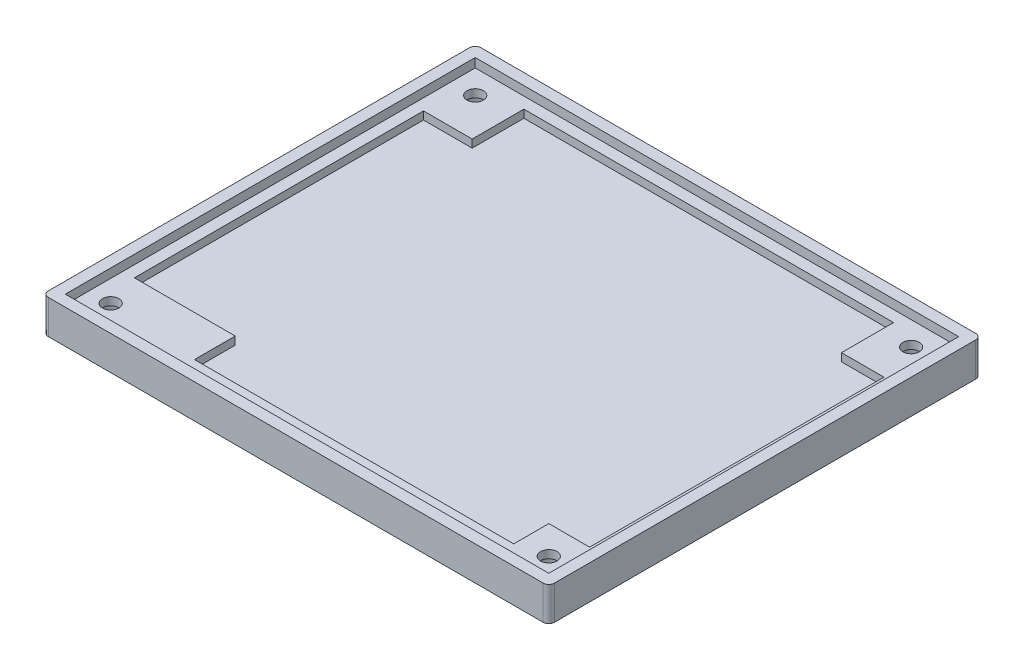
ISO-10303-21;
HEADER;
FILE_DESCRIPTION(('STEP AP214'),'2;1');
FILE_NAME('part.step','',(''),(''),'','','');
FILE_SCHEMA(('AUTOMOTIVE_DESIGN { 1 0 10303 214 1 1 1 1 }'));
ENDSEC;
DATA;
#1=APPLICATION_CONTEXT('core data for automotive mechanical design processes');
#2=APPLICATION_PROTOCOL_DEFINITION('international standard','automotive_design',2000,#1);
#3=PRODUCT_CONTEXT('',#1,'mechanical');
#4=PRODUCT('Part','Part','',(#3));
#5=PRODUCT_RELATED_PRODUCT_CATEGORY('part','',(#4));
#6=PRODUCT_DEFINITION_FORMATION('','',#4);
#7=PRODUCT_DEFINITION_CONTEXT('part definition',#1,'design');
#8=PRODUCT_DEFINITION('design','',#6,#7);
#9=PRODUCT_DEFINITION_SHAPE('','',#8);
#10=(LENGTH_UNIT() NAMED_UNIT(*) SI_UNIT(.MILLI.,.METRE.));
#11=(NAMED_UNIT(*) PLANE_ANGLE_UNIT() SI_UNIT($,.RADIAN.));
#12=(NAMED_UNIT(*) SI_UNIT($,.STERADIAN.) SOLID_ANGLE_UNIT());
#13=UNCERTAINTY_MEASURE_WITH_UNIT(LENGTH_MEASURE(1.E-05),#10,'distance_accuracy_value','');
#14=(GEOMETRIC_REPRESENTATION_CONTEXT(3) GLOBAL_UNCERTAINTY_ASSIGNED_CONTEXT((#13)) GLOBAL_UNIT_ASSIGNED_CONTEXT((#10,
#11,#12)) REPRESENTATION_CONTEXT('',''));
#15=CARTESIAN_POINT('',(0.,0.,0.));
#16=DIRECTION('',(0.,0.,1.));
#17=DIRECTION('',(1.,0.,0.));
#18=AXIS2_PLACEMENT_3D('',#15,#16,#17);
#19=CARTESIAN_POINT('',(13.6094686628136,-6.,-36.5043022127827));
#20=DIRECTION('',(0.,1.,0.));
#21=DIRECTION('',(0.,0.,1.));
#22=AXIS2_PLACEMENT_3D('',#19,#20,#21);
#23=CYLINDRICAL_SURFACE('',#22,1.45);
#24=CARTESIAN_POINT('',(13.6094686628136,-1.6,-36.5043022127827));
#25=DIRECTION('',(0.,1.,0.));
#26=DIRECTION('',(0.,0.,1.));
#27=AXIS2_PLACEMENT_3D('',#24,#25,#26);
#28=CIRCLE('',#27,1.45);
#29=CARTESIAN_POINT('',(13.6094686628136,-1.6,-35.0543022127827));
#30=VERTEX_POINT('',#29);
#31=EDGE_CURVE('E216',#30,#30,#28,.T.);
#32=ORIENTED_EDGE('',*,*,#31,.T.);
#33=EDGE_LOOP('',(#32));
#34=FACE_BOUND('',#33,.T.);
#35=CARTESIAN_POINT('',(13.6094686628136,-3.,-36.5043022127827));
#36=DIRECTION('',(0.,-1.,0.));
#37=DIRECTION('',(0.,0.,-1.));
#38=AXIS2_PLACEMENT_3D('',#35,#36,#37);
#39=CIRCLE('',#38,1.45);
#40=CARTESIAN_POINT('',(13.6094686628136,-3.,-37.9543022127827));
#41=VERTEX_POINT('',#40);
#42=EDGE_CURVE('E37',#41,#41,#39,.F.);
#43=ORIENTED_EDGE('',*,*,#42,.F.);
#44=EDGE_LOOP('',(#43));
#45=FACE_BOUND('',#44,.T.);
#46=ADVANCED_FACE('F33',(#34,#45),#23,.F.);
#47=CARTESIAN_POINT('',(-63.7758367272501,-6.,27.4956977872173));
#48=DIRECTION('',(0.,1.,0.));
#49=DIRECTION('',(0.,0.,1.));
#50=AXIS2_PLACEMENT_3D('',#47,#48,#49);
#51=CYLINDRICAL_SURFACE('',#50,1.45);
#52=CARTESIAN_POINT('',(-63.7758367272501,-1.6,27.4956977872173));
#53=DIRECTION('',(0.,1.,0.));
#54=DIRECTION('',(0.,0.,1.));
#55=AXIS2_PLACEMENT_3D('',#52,#53,#54);
#56=CIRCLE('',#55,1.45);
#57=CARTESIAN_POINT('',(-63.7758367272501,-1.6,28.9456977872173));
#58=VERTEX_POINT('',#57);
#59=EDGE_CURVE('E354',#58,#58,#56,.T.);
#60=ORIENTED_EDGE('',*,*,#59,.T.);
#61=EDGE_LOOP('',(#60));
#62=FACE_BOUND('',#61,.T.);
#63=CARTESIAN_POINT('',(-63.7758367272501,-3.,27.4956977872173));
#64=DIRECTION('',(0.,-1.,0.));
#65=DIRECTION('',(0.,0.,-1.));
#66=AXIS2_PLACEMENT_3D('',#63,#64,#65);
#67=CIRCLE('',#66,1.45);
#68=CARTESIAN_POINT('',(-63.7758367272501,-3.,26.0456977872173));
#69=VERTEX_POINT('',#68);
#70=EDGE_CURVE('E349',#69,#69,#67,.F.);
#71=ORIENTED_EDGE('',*,*,#70,.F.);
#72=EDGE_LOOP('',(#71));
#73=FACE_BOUND('',#72,.T.);
#74=ADVANCED_FACE('F464',(#62,#73),#51,.F.);
#75=CARTESIAN_POINT('',(-63.3905313371864,-6.,-36.5043022127827));
#76=DIRECTION('',(0.,1.,0.));
#77=DIRECTION('',(0.,0.,1.));
#78=AXIS2_PLACEMENT_3D('',#75,#76,#77);
#79=CYLINDRICAL_SURFACE('',#78,1.45);
#80=CARTESIAN_POINT('',(-63.3905313371864,-1.6,-36.5043022127827));
#81=DIRECTION('',(0.,1.,0.));
#82=DIRECTION('',(0.,0.,1.));
#83=AXIS2_PLACEMENT_3D('',#80,#81,#82);
#84=CIRCLE('',#83,1.45);
#85=CARTESIAN_POINT('',(-63.3905313371864,-1.6,-35.0543022127827));
#86=VERTEX_POINT('',#85);
#87=EDGE_CURVE('E358',#86,#86,#84,.T.);
#88=ORIENTED_EDGE('',*,*,#87,.T.);
#89=EDGE_LOOP('',(#88));
#90=FACE_BOUND('',#89,.T.);
#91=CARTESIAN_POINT('',(-63.3905313371864,-3.,-36.5043022127827));
#92=DIRECTION('',(0.,-1.,0.));
#93=DIRECTION('',(0.,0.,-1.));
#94=AXIS2_PLACEMENT_3D('',#91,#92,#93);
#95=CIRCLE('',#94,1.45);
#96=CARTESIAN_POINT('',(-63.3905313371864,-3.,-37.9543022127827));
#97=VERTEX_POINT('',#96);
#98=EDGE_CURVE('E346',#97,#97,#95,.F.);
#99=ORIENTED_EDGE('',*,*,#98,.F.);
#100=EDGE_LOOP('',(#99));
#101=FACE_BOUND('',#100,.T.);
#102=ADVANCED_FACE('F470',(#90,#101),#79,.F.);
#103=CARTESIAN_POINT('',(13.6094686628136,-6.,27.4956977872173));
#104=DIRECTION('',(0.,1.,0.));
#105=DIRECTION('',(0.,0.,1.));
#106=AXIS2_PLACEMENT_3D('',#103,#104,#105);
#107=CYLINDRICAL_SURFACE('',#106,1.45);
#108=CARTESIAN_POINT('',(13.6094686628136,-1.6,27.4956977872173));
#109=DIRECTION('',(0.,1.,0.));
#110=DIRECTION('',(0.,0.,1.));
#111=AXIS2_PLACEMENT_3D('',#108,#109,#110);
#112=CIRCLE('',#111,1.45);
#113=CARTESIAN_POINT('',(13.6094686628136,-1.6,28.9456977872173));
#114=VERTEX_POINT('',#113);
#115=EDGE_CURVE('E363',#114,#114,#112,.T.);
#116=ORIENTED_EDGE('',*,*,#115,.T.);
#117=EDGE_LOOP('',(#116));
#118=FACE_BOUND('',#117,.T.);
#119=CARTESIAN_POINT('',(13.6094686628136,-3.,27.4956977872173));
#120=DIRECTION('',(0.,-1.,0.));
#121=DIRECTION('',(0.,0.,-1.));
#122=AXIS2_PLACEMENT_3D('',#119,#120,#121);
#123=CIRCLE('',#122,1.45);
#124=CARTESIAN_POINT('',(13.6094686628136,-3.,26.0456977872173));
#125=VERTEX_POINT('',#124);
#126=EDGE_CURVE('E343',#125,#125,#123,.F.);
#127=ORIENTED_EDGE('',*,*,#126,.F.);
#128=EDGE_LOOP('',(#127));
#129=FACE_BOUND('',#128,.T.);
#130=ADVANCED_FACE('F651',(#118,#129),#107,.F.);
#131=CARTESIAN_POINT('',(0.,-1.6,0.));
#132=DIRECTION('',(0.,1.,0.));
#133=DIRECTION('',(0.,0.,1.));
#134=AXIS2_PLACEMENT_3D('',#131,#132,#133);
#135=PLANE('',#134);
#136=ORIENTED_EDGE('',*,*,#115,.F.);
#137=EDGE_LOOP('',(#136));
#138=FACE_BOUND('',#137,.T.);
#139=ORIENTED_EDGE('',*,*,#87,.F.);
#140=EDGE_LOOP('',(#139));
#141=FACE_BOUND('',#140,.T.);
#142=ORIENTED_EDGE('',*,*,#59,.F.);
#143=EDGE_LOOP('',(#142));
#144=FACE_BOUND('',#143,.T.);
#145=ORIENTED_EDGE('',*,*,#31,.F.);
#146=EDGE_LOOP('',(#145));
#147=FACE_BOUND('',#146,.T.);
#148=DIRECTION('',(0.,0.,1.));
#149=VECTOR('',#148,1.);
#150=CARTESIAN_POINT('',(-67.5905313371864,-1.6,-40.7043022127827));
#151=LINE('',#150,#149);
#152=CARTESIAN_POINT('',(-67.5905313371864,-1.6,-40.7043022127827));
#153=VERTEX_POINT('',#152);
#154=CARTESIAN_POINT('',(-67.5905313371864,-1.6,31.6956977872173));
#155=VERTEX_POINT('',#154);
#156=EDGE_CURVE('E230',#153,#155,#151,.T.);
#157=ORIENTED_EDGE('',*,*,#156,.T.);
#158=DIRECTION('',(1.,0.,0.));
#159=VECTOR('',#158,1.);
#160=CARTESIAN_POINT('',(-67.5905313371864,-1.6,31.6956977872173));
#161=LINE('',#160,#159);
#162=CARTESIAN_POINT('',(17.8094686628136,-1.6,31.6956977872173));
#163=VERTEX_POINT('',#162);
#164=EDGE_CURVE('E233',#155,#163,#161,.T.);
#165=ORIENTED_EDGE('',*,*,#164,.T.);
#166=DIRECTION('',(0.,0.,1.));
#167=VECTOR('',#166,1.);
#168=CARTESIAN_POINT('',(17.8094686628136,-1.6,-40.7043022127827));
#169=LINE('',#168,#167);
#170=CARTESIAN_POINT('',(17.8094686628136,-1.6,-40.7043022127827));
#171=VERTEX_POINT('',#170);
#172=EDGE_CURVE('E237',#171,#163,#169,.T.);
#173=ORIENTED_EDGE('',*,*,#172,.F.);
#174=DIRECTION('',(1.,0.,0.));
#175=VECTOR('',#174,1.);
#176=CARTESIAN_POINT('',(-67.5905313371864,-1.6,-40.7043022127827));
#177=LINE('',#176,#175);
#178=EDGE_CURVE('E239',#153,#171,#177,.T.);
#179=ORIENTED_EDGE('',*,*,#178,.F.);
#180=EDGE_LOOP('',(#157,#165,#173,#179));
#181=FACE_BOUND('',#180,.T.);
#182=DIRECTION('',(-1.,0.,0.));
#183=VECTOR('',#182,1.);
#184=CARTESIAN_POINT('',(0.,-1.6,21.4956977872173));
#185=LINE('',#184,#183);
#186=CARTESIAN_POINT('',(-47.7758367272501,-1.6,21.4956977872174));
#187=VERTEX_POINT('',#186);
#188=CARTESIAN_POINT('',(-65.5905313371864,-1.6,21.4956977872174));
#189=VERTEX_POINT('',#188);
#190=EDGE_CURVE('E269',#187,#189,#185,.T.);
#191=ORIENTED_EDGE('',*,*,#190,.T.);
#192=DIRECTION('',(0.,0.,-1.));
#193=VECTOR('',#192,1.);
#194=CARTESIAN_POINT('',(-65.5905313371864,-1.6,0.));
#195=LINE('',#194,#193);
#196=CARTESIAN_POINT('',(-65.5905313371864,-1.6,-29.5681693862675));
#197=VERTEX_POINT('',#196);
#198=EDGE_CURVE('E309',#189,#197,#195,.T.);
#199=ORIENTED_EDGE('',*,*,#198,.T.);
#200=DIRECTION('',(1.,0.,0.));
#201=VECTOR('',#200,1.);
#202=CARTESIAN_POINT('',(0.,-1.6,-29.5681693862675));
#203=LINE('',#202,#201);
#204=CARTESIAN_POINT('',(-56.9905313371864,-1.6,-29.5681693862675));
#205=VERTEX_POINT('',#204);
#206=EDGE_CURVE('E220',#197,#205,#203,.T.);
#207=ORIENTED_EDGE('',*,*,#206,.T.);
#208=DIRECTION('',(0.,0.,-1.));
#209=VECTOR('',#208,1.);
#210=CARTESIAN_POINT('',(-56.9905313371864,-1.6,0.));
#211=LINE('',#210,#209);
#212=CARTESIAN_POINT('',(-56.9905313371864,-1.6,-38.7043022127827));
#213=VERTEX_POINT('',#212);
#214=EDGE_CURVE('E305',#205,#213,#211,.T.);
#215=ORIENTED_EDGE('',*,*,#214,.T.);
#216=DIRECTION('',(1.,0.,0.));
#217=VECTOR('',#216,1.);
#218=CARTESIAN_POINT('',(0.,-1.6,-38.7043022127827));
#219=LINE('',#218,#217);
#220=CARTESIAN_POINT('',(8.30946866281362,-1.6,-38.7043022127827));
#221=VERTEX_POINT('',#220);
#222=EDGE_CURVE('E302',#213,#221,#219,.T.);
#223=ORIENTED_EDGE('',*,*,#222,.T.);
#224=DIRECTION('',(0.,0.,1.));
#225=VECTOR('',#224,1.);
#226=CARTESIAN_POINT('',(8.30946866281362,-1.6,0.));
#227=LINE('',#226,#225);
#228=CARTESIAN_POINT('',(8.30946866281362,-1.6,-29.5043022127827));
#229=VERTEX_POINT('',#228);
#230=EDGE_CURVE('E299',#221,#229,#227,.T.);
#231=ORIENTED_EDGE('',*,*,#230,.T.);
#232=DIRECTION('',(1.,0.,0.));
#233=VECTOR('',#232,1.);
#234=CARTESIAN_POINT('',(0.,-1.6,-29.5043022127827));
#235=LINE('',#234,#233);
#236=CARTESIAN_POINT('',(15.8094686628136,-1.6,-29.5043022127827));
#237=VERTEX_POINT('',#236);
#238=EDGE_CURVE('E296',#229,#237,#235,.T.);
#239=ORIENTED_EDGE('',*,*,#238,.T.);
#240=DIRECTION('',(0.,0.,1.));
#241=VECTOR('',#240,1.);
#242=CARTESIAN_POINT('',(15.8094686628136,-1.6,0.));
#243=LINE('',#242,#241);
#244=CARTESIAN_POINT('',(15.8094686628136,-1.6,22.4956977872173));
#245=VERTEX_POINT('',#244);
#246=EDGE_CURVE('E293',#237,#245,#243,.T.);
#247=ORIENTED_EDGE('',*,*,#246,.T.);
#248=DIRECTION('',(-1.,0.,0.));
#249=VECTOR('',#248,1.);
#250=CARTESIAN_POINT('',(0.,-1.6,22.4956977872173));
#251=LINE('',#250,#249);
#252=CARTESIAN_POINT('',(8.60946866281364,-1.6,22.4956977872173));
#253=VERTEX_POINT('',#252);
#254=EDGE_CURVE('E290',#245,#253,#251,.T.);
#255=ORIENTED_EDGE('',*,*,#254,.T.);
#256=DIRECTION('',(0.,0.,1.));
#257=VECTOR('',#256,1.);
#258=CARTESIAN_POINT('',(8.60946866281364,-1.6,0.));
#259=LINE('',#258,#257);
#260=CARTESIAN_POINT('',(8.60946866281364,-1.6,28.6956977872173));
#261=VERTEX_POINT('',#260);
#262=EDGE_CURVE('E287',#253,#261,#259,.T.);
#263=ORIENTED_EDGE('',*,*,#262,.T.);
#264=DIRECTION('',(-1.,0.,0.));
#265=VECTOR('',#264,1.);
#266=CARTESIAN_POINT('',(0.,-1.6,28.6956977872174));
#267=LINE('',#266,#265);
#268=CARTESIAN_POINT('',(-47.7758367272501,-1.6,28.6956977872174));
#269=VERTEX_POINT('',#268);
#270=EDGE_CURVE('E284',#261,#269,#267,.T.);
#271=ORIENTED_EDGE('',*,*,#270,.T.);
#272=DIRECTION('',(0.,0.,-1.));
#273=VECTOR('',#272,1.);
#274=CARTESIAN_POINT('',(-47.7758367272501,-1.6,0.));
#275=LINE('',#274,#273);
#276=EDGE_CURVE('E281',#269,#187,#275,.T.);
#277=ORIENTED_EDGE('',*,*,#276,.T.);
#278=EDGE_LOOP('',(#191,#199,#207,#215,#223,#231,#239,#247,#255,#263,#271,#277));
#279=FACE_BOUND('',#278,.T.);
#280=ADVANCED_FACE('F422',(#138,#141,#144,#147,#181,#279),#135,.T.);
#281=CARTESIAN_POINT('',(-69.5905313371864,-6.,-42.7043022127827));
#282=DIRECTION('',(-1.,0.,0.));
#283=DIRECTION('',(0.,0.,1.));
#284=AXIS2_PLACEMENT_3D('',#281,#282,#283);
#285=PLANE('',#284);
#286=DIRECTION('',(0.,0.,1.));
#287=VECTOR('',#286,1.);
#288=CARTESIAN_POINT('',(-69.5905313371864,-6.,-42.7043022127827));
#289=LINE('',#288,#287);
#290=CARTESIAN_POINT('',(-69.5905313371864,-6.,-41.7043022127827));
#291=VERTEX_POINT('',#290);
#292=CARTESIAN_POINT('',(-69.5905313371864,-6.,32.6956977872174));
#293=VERTEX_POINT('',#292);
#294=EDGE_CURVE('E258',#291,#293,#289,.T.);
#295=ORIENTED_EDGE('',*,*,#294,.T.);
#296=DIRECTION('',(0.,1.,0.));
#297=VECTOR('',#296,1.);
#298=CARTESIAN_POINT('',(-69.5905313371864,-6.,32.6956977872174));
#299=LINE('',#298,#297);
#300=CARTESIAN_POINT('',(-69.5905313371864,0.,32.6956977872174));
#301=VERTEX_POINT('',#300);
#302=EDGE_CURVE('E313',#293,#301,#299,.T.);
#303=ORIENTED_EDGE('',*,*,#302,.T.);
#304=DIRECTION('',(0.,0.,1.));
#305=VECTOR('',#304,1.);
#306=CARTESIAN_POINT('',(-69.5905313371864,0.,-42.7043022127827));
#307=LINE('',#306,#305);
#308=CARTESIAN_POINT('',(-69.5905313371864,0.,-41.7043022127827));
#309=VERTEX_POINT('',#308);
#310=EDGE_CURVE('E251',#309,#301,#307,.T.);
#311=ORIENTED_EDGE('',*,*,#310,.F.);
#312=DIRECTION('',(0.,1.,0.));
#313=VECTOR('',#312,1.);
#314=CARTESIAN_POINT('',(-69.5905313371864,-6.,-41.7043022127827));
#315=LINE('',#314,#313);
#316=EDGE_CURVE('E311',#309,#291,#315,.F.);
#317=ORIENTED_EDGE('',*,*,#316,.T.);
#318=EDGE_LOOP('',(#295,#303,#311,#317));
#319=FACE_BOUND('',#318,.T.);
#320=ADVANCED_FACE('F719',(#319),#285,.T.);
#321=CARTESIAN_POINT('',(-69.5905313371864,-6.,-42.7043022127827));
#322=DIRECTION('',(0.,0.,1.));
#323=DIRECTION('',(1.,0.,0.));
#324=AXIS2_PLACEMENT_3D('',#321,#322,#323);
#325=PLANE('',#324);
#326=DIRECTION('',(1.,0.,0.));
#327=VECTOR('',#326,1.);
#328=CARTESIAN_POINT('',(-69.5905313371864,-6.,-42.7043022127827));
#329=LINE('',#328,#327);
#330=CARTESIAN_POINT('',(-68.5905313371864,-6.,-42.7043022127827));
#331=VERTEX_POINT('',#330);
#332=CARTESIAN_POINT('',(18.8094686628136,-6.,-42.7043022127827));
#333=VERTEX_POINT('',#332);
#334=EDGE_CURVE('E267',#331,#333,#329,.T.);
#335=ORIENTED_EDGE('',*,*,#334,.F.);
#336=DIRECTION('',(0.,1.,0.));
#337=VECTOR('',#336,1.);
#338=CARTESIAN_POINT('',(-68.5905313371864,0.,-42.7043022127827));
#339=LINE('',#338,#337);
#340=CARTESIAN_POINT('',(-68.5905313371864,0.,-42.7043022127827));
#341=VERTEX_POINT('',#340);
#342=EDGE_CURVE('E338',#331,#341,#339,.T.);
#343=ORIENTED_EDGE('',*,*,#342,.T.);
#344=DIRECTION('',(1.,0.,0.));
#345=VECTOR('',#344,1.);
#346=CARTESIAN_POINT('',(-69.5905313371864,0.,-42.7043022127827));
#347=LINE('',#346,#345);
#348=CARTESIAN_POINT('',(18.8094686628136,0.,-42.7043022127827));
#349=VERTEX_POINT('',#348);
#350=EDGE_CURVE('E262',#341,#349,#347,.T.);
#351=ORIENTED_EDGE('',*,*,#350,.T.);
#352=DIRECTION('',(0.,1.,0.));
#353=VECTOR('',#352,1.);
#354=CARTESIAN_POINT('',(18.8094686628136,-6.,-42.7043022127827));
#355=LINE('',#354,#353);
#356=EDGE_CURVE('E336',#349,#333,#355,.F.);
#357=ORIENTED_EDGE('',*,*,#356,.T.);
#358=EDGE_LOOP('',(#335,#343,#351,#357));
#359=FACE_BOUND('',#358,.T.);
#360=ADVANCED_FACE('F789',(#359),#325,.F.);
#361=CARTESIAN_POINT('',(19.8094686628136,-6.,-42.7043022127827));
#362=DIRECTION('',(-1.,0.,0.));
#363=DIRECTION('',(0.,0.,1.));
#364=AXIS2_PLACEMENT_3D('',#361,#362,#363);
#365=PLANE('',#364);
#366=DIRECTION('',(0.,0.,1.));
#367=VECTOR('',#366,1.);
#368=CARTESIAN_POINT('',(19.8094686628136,0.,-42.7043022127827));
#369=LINE('',#368,#367);
#370=CARTESIAN_POINT('',(19.8094686628136,0.,-41.7043022127827));
#371=VERTEX_POINT('',#370);
#372=CARTESIAN_POINT('',(19.8094686628136,0.,32.6956977872174));
#373=VERTEX_POINT('',#372);
#374=EDGE_CURVE('E275',#371,#373,#369,.T.);
#375=ORIENTED_EDGE('',*,*,#374,.T.);
#376=DIRECTION('',(0.,1.,0.));
#377=VECTOR('',#376,1.);
#378=CARTESIAN_POINT('',(19.8094686628136,-6.,32.6956977872174));
#379=LINE('',#378,#377);
#380=CARTESIAN_POINT('',(19.8094686628136,-6.,32.6956977872174));
#381=VERTEX_POINT('',#380);
#382=EDGE_CURVE('E11',#373,#381,#379,.F.);
#383=ORIENTED_EDGE('',*,*,#382,.T.);
#384=DIRECTION('',(0.,0.,1.));
#385=VECTOR('',#384,1.);
#386=CARTESIAN_POINT('',(19.8094686628136,-6.,-42.7043022127827));
#387=LINE('',#386,#385);
#388=CARTESIAN_POINT('',(19.8094686628136,-6.,-41.7043022127827));
#389=VERTEX_POINT('',#388);
#390=EDGE_CURVE('E265',#389,#381,#387,.T.);
#391=ORIENTED_EDGE('',*,*,#390,.F.);
#392=DIRECTION('',(0.,1.,0.));
#393=VECTOR('',#392,1.);
#394=CARTESIAN_POINT('',(19.8094686628136,-6.,-41.7043022127827));
#395=LINE('',#394,#393);
#396=EDGE_CURVE('E42',#389,#371,#395,.T.);
#397=ORIENTED_EDGE('',*,*,#396,.T.);
#398=EDGE_LOOP('',(#375,#383,#391,#397));
#399=FACE_BOUND('',#398,.T.);
#400=ADVANCED_FACE('F780',(#399),#365,.F.);
#401=CARTESIAN_POINT('',(-69.5905313371864,-6.,33.6956977872174));
#402=DIRECTION('',(0.,0.,1.));
#403=DIRECTION('',(1.,0.,0.));
#404=AXIS2_PLACEMENT_3D('',#401,#402,#403);
#405=PLANE('',#404);
#406=DIRECTION('',(1.,0.,0.));
#407=VECTOR('',#406,1.);
#408=CARTESIAN_POINT('',(-69.5905313371864,0.,33.6956977872174));
#409=LINE('',#408,#407);
#410=CARTESIAN_POINT('',(-68.5905313371864,0.,33.6956977872174));
#411=VERTEX_POINT('',#410);
#412=CARTESIAN_POINT('',(18.8094686628136,0.,33.6956977872174));
#413=VERTEX_POINT('',#412);
#414=EDGE_CURVE('E272',#411,#413,#409,.T.);
#415=ORIENTED_EDGE('',*,*,#414,.F.);
#416=DIRECTION('',(0.,1.,0.));
#417=VECTOR('',#416,1.);
#418=CARTESIAN_POINT('',(-68.5905313371864,-6.,33.6956977872174));
#419=LINE('',#418,#417);
#420=CARTESIAN_POINT('',(-68.5905313371864,-6.,33.6956977872174));
#421=VERTEX_POINT('',#420);
#422=EDGE_CURVE('E327',#411,#421,#419,.F.);
#423=ORIENTED_EDGE('',*,*,#422,.T.);
#424=DIRECTION('',(1.,0.,0.));
#425=VECTOR('',#424,1.);
#426=CARTESIAN_POINT('',(-69.5905313371864,-6.,33.6956977872174));
#427=LINE('',#426,#425);
#428=CARTESIAN_POINT('',(18.8094686628136,-6.,33.6956977872174));
#429=VERTEX_POINT('',#428);
#430=EDGE_CURVE('E261',#421,#429,#427,.T.);
#431=ORIENTED_EDGE('',*,*,#430,.T.);
#432=DIRECTION('',(0.,1.,0.));
#433=VECTOR('',#432,1.);
#434=CARTESIAN_POINT('',(18.8094686628136,0.,33.6956977872174));
#435=LINE('',#434,#433);
#436=EDGE_CURVE('E324',#429,#413,#435,.T.);
#437=ORIENTED_EDGE('',*,*,#436,.T.);
#438=EDGE_LOOP('',(#415,#423,#431,#437));
#439=FACE_BOUND('',#438,.T.);
#440=ADVANCED_FACE('F772',(#439),#405,.T.);
#441=CARTESIAN_POINT('',(0.,-6.,0.));
#442=DIRECTION('',(0.,1.,0.));
#443=DIRECTION('',(0.,0.,1.));
#444=AXIS2_PLACEMENT_3D('',#441,#442,#443);
#445=PLANE('',#444);
#446=CARTESIAN_POINT('',(-63.3905313371864,-6.,-36.5043022127827));
#447=DIRECTION('',(0.,-1.,0.));
#448=DIRECTION('',(0.,0.,-1.));
#449=AXIS2_PLACEMENT_3D('',#446,#447,#448);
#450=CIRCLE('',#449,3.5);
#451=CARTESIAN_POINT('',(-63.3905313371864,-6.,-40.0043022127827));
#452=VERTEX_POINT('',#451);
#453=EDGE_CURVE('E844',#452,#452,#450,.T.);
#454=ORIENTED_EDGE('',*,*,#453,.F.);
#455=EDGE_LOOP('',(#454));
#456=FACE_BOUND('',#455,.T.);
#457=CARTESIAN_POINT('',(13.6094686628136,-6.,-36.5043022127827));
#458=DIRECTION('',(0.,-1.,0.));
#459=DIRECTION('',(0.,0.,-1.));
#460=AXIS2_PLACEMENT_3D('',#457,#458,#459);
#461=CIRCLE('',#460,3.5);
#462=CARTESIAN_POINT('',(13.6094686628136,-6.,-40.0043022127827));
#463=VERTEX_POINT('',#462);
#464=EDGE_CURVE('E848',#463,#463,#461,.T.);
#465=ORIENTED_EDGE('',*,*,#464,.F.);
#466=EDGE_LOOP('',(#465));
#467=FACE_BOUND('',#466,.T.);
#468=CARTESIAN_POINT('',(13.6094686628136,-6.,27.4956977872173));
#469=DIRECTION('',(0.,-1.,0.));
#470=DIRECTION('',(0.,0.,-1.));
#471=AXIS2_PLACEMENT_3D('',#468,#469,#470);
#472=CIRCLE('',#471,3.5);
#473=CARTESIAN_POINT('',(13.6094686628136,-6.,23.9956977872173));
#474=VERTEX_POINT('',#473);
#475=EDGE_CURVE('E852',#474,#474,#472,.T.);
#476=ORIENTED_EDGE('',*,*,#475,.F.);
#477=EDGE_LOOP('',(#476));
#478=FACE_BOUND('',#477,.T.);
#479=CARTESIAN_POINT('',(-63.7758367272501,-6.,27.4956977872173));
#480=DIRECTION('',(0.,-1.,0.));
#481=DIRECTION('',(0.,0.,-1.));
#482=AXIS2_PLACEMENT_3D('',#479,#480,#481);
#483=CIRCLE('',#482,3.5);
#484=CARTESIAN_POINT('',(-63.7758367272501,-6.,23.9956977872173));
#485=VERTEX_POINT('',#484);
#486=EDGE_CURVE('E366',#485,#485,#483,.T.);
#487=ORIENTED_EDGE('',*,*,#486,.F.);
#488=EDGE_LOOP('',(#487));
#489=FACE_BOUND('',#488,.T.);
#490=ORIENTED_EDGE('',*,*,#430,.F.);
#491=CARTESIAN_POINT('',(-68.5905313371864,-6.,32.6956977872174));
#492=DIRECTION('',(0.,1.,0.));
#493=DIRECTION('',(0.,0.,1.));
#494=AXIS2_PLACEMENT_3D('',#491,#492,#493);
#495=CIRCLE('',#494,1.);
#496=EDGE_CURVE('E334',#421,#293,#495,.F.);
#497=ORIENTED_EDGE('',*,*,#496,.T.);
#498=ORIENTED_EDGE('',*,*,#294,.F.);
#499=CARTESIAN_POINT('',(-68.5905313371864,-6.,-41.7043022127827));
#500=DIRECTION('',(0.,1.,0.));
#501=DIRECTION('',(0.,0.,1.));
#502=AXIS2_PLACEMENT_3D('',#499,#500,#501);
#503=CIRCLE('',#502,1.);
#504=EDGE_CURVE('E332',#291,#331,#503,.F.);
#505=ORIENTED_EDGE('',*,*,#504,.T.);
#506=ORIENTED_EDGE('',*,*,#334,.T.);
#507=CARTESIAN_POINT('',(18.8094686628136,-6.,-41.7043022127827));
#508=DIRECTION('',(0.,1.,0.));
#509=DIRECTION('',(0.,0.,1.));
#510=AXIS2_PLACEMENT_3D('',#507,#508,#509);
#511=CIRCLE('',#510,1.);
#512=EDGE_CURVE('E55',#333,#389,#511,.F.);
#513=ORIENTED_EDGE('',*,*,#512,.T.);
#514=ORIENTED_EDGE('',*,*,#390,.T.);
#515=CARTESIAN_POINT('',(18.8094686628136,-6.,32.6956977872174));
#516=DIRECTION('',(0.,1.,0.));
#517=DIRECTION('',(0.,0.,1.));
#518=AXIS2_PLACEMENT_3D('',#515,#516,#517);
#519=CIRCLE('',#518,1.);
#520=EDGE_CURVE('E330',#381,#429,#519,.F.);
#521=ORIENTED_EDGE('',*,*,#520,.T.);
#522=EDGE_LOOP('',(#490,#497,#498,#505,#506,#513,#514,#521));
#523=FACE_BOUND('',#522,.T.);
#524=ADVANCED_FACE('F763',(#456,#467,#478,#489,#523),#445,.F.);
#525=CARTESIAN_POINT('',(0.,0.,0.));
#526=DIRECTION('',(0.,1.,0.));
#527=DIRECTION('',(0.,0.,1.));
#528=AXIS2_PLACEMENT_3D('',#525,#526,#527);
#529=PLANE('',#528);
#530=DIRECTION('',(0.,0.,1.));
#531=VECTOR('',#530,1.);
#532=CARTESIAN_POINT('',(-67.5905313371864,0.,-40.7043022127827));
#533=LINE('',#532,#531);
#534=CARTESIAN_POINT('',(-67.5905313371864,0.,-40.7043022127827));
#535=VERTEX_POINT('',#534);
#536=CARTESIAN_POINT('',(-67.5905313371864,0.,31.6956977872173));
#537=VERTEX_POINT('',#536);
#538=EDGE_CURVE('E221',#535,#537,#533,.T.);
#539=ORIENTED_EDGE('',*,*,#538,.F.);
#540=DIRECTION('',(1.,0.,0.));
#541=VECTOR('',#540,1.);
#542=CARTESIAN_POINT('',(-67.5905313371864,0.,-40.7043022127827));
#543=LINE('',#542,#541);
#544=CARTESIAN_POINT('',(17.8094686628136,0.,-40.7043022127827));
#545=VERTEX_POINT('',#544);
#546=EDGE_CURVE('E234',#535,#545,#543,.T.);
#547=ORIENTED_EDGE('',*,*,#546,.T.);
#548=DIRECTION('',(0.,0.,1.));
#549=VECTOR('',#548,1.);
#550=CARTESIAN_POINT('',(17.8094686628136,0.,-40.7043022127827));
#551=LINE('',#550,#549);
#552=CARTESIAN_POINT('',(17.8094686628136,0.,31.6956977872173));
#553=VERTEX_POINT('',#552);
#554=EDGE_CURVE('E244',#545,#553,#551,.T.);
#555=ORIENTED_EDGE('',*,*,#554,.T.);
#556=DIRECTION('',(1.,0.,0.));
#557=VECTOR('',#556,1.);
#558=CARTESIAN_POINT('',(-67.5905313371864,0.,31.6956977872173));
#559=LINE('',#558,#557);
#560=EDGE_CURVE('E224',#537,#553,#559,.T.);
#561=ORIENTED_EDGE('',*,*,#560,.F.);
#562=EDGE_LOOP('',(#539,#547,#555,#561));
#563=FACE_BOUND('',#562,.T.);
#564=ORIENTED_EDGE('',*,*,#310,.T.);
#565=CARTESIAN_POINT('',(-68.5905313371864,0.,32.6956977872174));
#566=DIRECTION('',(0.,1.,0.));
#567=DIRECTION('',(0.,0.,1.));
#568=AXIS2_PLACEMENT_3D('',#565,#566,#567);
#569=CIRCLE('',#568,1.);
#570=EDGE_CURVE('E322',#301,#411,#569,.T.);
#571=ORIENTED_EDGE('',*,*,#570,.T.);
#572=ORIENTED_EDGE('',*,*,#414,.T.);
#573=CARTESIAN_POINT('',(18.8094686628136,0.,32.6956977872174));
#574=DIRECTION('',(0.,1.,0.));
#575=DIRECTION('',(0.,0.,1.));
#576=AXIS2_PLACEMENT_3D('',#573,#574,#575);
#577=CIRCLE('',#576,1.);
#578=EDGE_CURVE('E318',#413,#373,#577,.T.);
#579=ORIENTED_EDGE('',*,*,#578,.T.);
#580=ORIENTED_EDGE('',*,*,#374,.F.);
#581=CARTESIAN_POINT('',(18.8094686628136,0.,-41.7043022127827));
#582=DIRECTION('',(0.,1.,0.));
#583=DIRECTION('',(0.,0.,1.));
#584=AXIS2_PLACEMENT_3D('',#581,#582,#583);
#585=CIRCLE('',#584,1.);
#586=EDGE_CURVE('E316',#371,#349,#585,.T.);
#587=ORIENTED_EDGE('',*,*,#586,.T.);
#588=ORIENTED_EDGE('',*,*,#350,.F.);
#589=CARTESIAN_POINT('',(-68.5905313371864,0.,-41.7043022127827));
#590=DIRECTION('',(0.,1.,0.));
#591=DIRECTION('',(0.,0.,1.));
#592=AXIS2_PLACEMENT_3D('',#589,#590,#591);
#593=CIRCLE('',#592,1.);
#594=EDGE_CURVE('E320',#341,#309,#593,.T.);
#595=ORIENTED_EDGE('',*,*,#594,.T.);
#596=EDGE_LOOP('',(#564,#571,#572,#579,#580,#587,#588,#595));
#597=FACE_BOUND('',#596,.T.);
#598=ADVANCED_FACE('F755',(#563,#597),#529,.T.);
#599=CARTESIAN_POINT('',(-67.5905313371864,-1.6,-40.7043022127827));
#600=DIRECTION('',(-1.,0.,0.));
#601=DIRECTION('',(0.,0.,1.));
#602=AXIS2_PLACEMENT_3D('',#599,#600,#601);
#603=PLANE('',#602);
#604=ORIENTED_EDGE('',*,*,#538,.T.);
#605=DIRECTION('',(0.,1.,0.));
#606=VECTOR('',#605,1.);
#607=CARTESIAN_POINT('',(-67.5905313371864,-1.6,31.6956977872173));
#608=LINE('',#607,#606);
#609=EDGE_CURVE('E240',#155,#537,#608,.T.);
#610=ORIENTED_EDGE('',*,*,#609,.F.);
#611=ORIENTED_EDGE('',*,*,#156,.F.);
#612=DIRECTION('',(0.,1.,0.));
#613=VECTOR('',#612,1.);
#614=CARTESIAN_POINT('',(-67.5905313371864,-1.6,-40.7043022127827));
#615=LINE('',#614,#613);
#616=EDGE_CURVE('E249',#153,#535,#615,.T.);
#617=ORIENTED_EDGE('',*,*,#616,.T.);
#618=EDGE_LOOP('',(#604,#610,#611,#617));
#619=FACE_BOUND('',#618,.T.);
#620=ADVANCED_FACE('F746',(#619),#603,.F.);
#621=CARTESIAN_POINT('',(-67.5905313371864,-1.6,-40.7043022127827));
#622=DIRECTION('',(0.,0.,1.));
#623=DIRECTION('',(1.,0.,0.));
#624=AXIS2_PLACEMENT_3D('',#621,#622,#623);
#625=PLANE('',#624);
#626=ORIENTED_EDGE('',*,*,#546,.F.);
#627=ORIENTED_EDGE('',*,*,#616,.F.);
#628=ORIENTED_EDGE('',*,*,#178,.T.);
#629=DIRECTION('',(0.,1.,0.));
#630=VECTOR('',#629,1.);
#631=CARTESIAN_POINT('',(17.8094686628136,-1.6,-40.7043022127827));
#632=LINE('',#631,#630);
#633=EDGE_CURVE('E252',#171,#545,#632,.T.);
#634=ORIENTED_EDGE('',*,*,#633,.T.);
#635=EDGE_LOOP('',(#626,#627,#628,#634));
#636=FACE_BOUND('',#635,.T.);
#637=ADVANCED_FACE('F737',(#636),#625,.T.);
#638=CARTESIAN_POINT('',(17.8094686628136,-1.6,-40.7043022127827));
#639=DIRECTION('',(-1.,0.,0.));
#640=DIRECTION('',(0.,0.,1.));
#641=AXIS2_PLACEMENT_3D('',#638,#639,#640);
#642=PLANE('',#641);
#643=ORIENTED_EDGE('',*,*,#554,.F.);
#644=ORIENTED_EDGE('',*,*,#633,.F.);
#645=ORIENTED_EDGE('',*,*,#172,.T.);
#646=DIRECTION('',(0.,1.,0.));
#647=VECTOR('',#646,1.);
#648=CARTESIAN_POINT('',(17.8094686628136,-1.6,31.6956977872173));
#649=LINE('',#648,#647);
#650=EDGE_CURVE('E254',#163,#553,#649,.T.);
#651=ORIENTED_EDGE('',*,*,#650,.T.);
#652=EDGE_LOOP('',(#643,#644,#645,#651));
#653=FACE_BOUND('',#652,.T.);
#654=ADVANCED_FACE('F728',(#653),#642,.T.);
#655=CARTESIAN_POINT('',(-67.5905313371864,-1.6,31.6956977872173));
#656=DIRECTION('',(0.,0.,1.));
#657=DIRECTION('',(1.,0.,0.));
#658=AXIS2_PLACEMENT_3D('',#655,#656,#657);
#659=PLANE('',#658);
#660=ORIENTED_EDGE('',*,*,#560,.T.);
#661=ORIENTED_EDGE('',*,*,#650,.F.);
#662=ORIENTED_EDGE('',*,*,#164,.F.);
#663=ORIENTED_EDGE('',*,*,#609,.T.);
#664=EDGE_LOOP('',(#660,#661,#662,#663));
#665=FACE_BOUND('',#664,.T.);
#666=ADVANCED_FACE('F711',(#665),#659,.F.);
#667=CARTESIAN_POINT('',(-65.5905313371864,-3.,21.4956977872174));
#668=DIRECTION('',(1.,0.,0.));
#669=DIRECTION('',(0.,0.,-1.));
#670=AXIS2_PLACEMENT_3D('',#667,#668,#669);
#671=PLANE('',#670);
#672=DIRECTION('',(0.,1.,0.));
#673=VECTOR('',#672,1.);
#674=CARTESIAN_POINT('',(-65.5905313371864,-3.,21.4956977872174));
#675=LINE('',#674,#673);
#676=CARTESIAN_POINT('',(-65.5905313371864,-3.,21.4956977872174));
#677=VERTEX_POINT('',#676);
#678=EDGE_CURVE('E215',#677,#189,#675,.T.);
#679=ORIENTED_EDGE('',*,*,#678,.F.);
#680=DIRECTION('',(0.,0.,-1.));
#681=VECTOR('',#680,1.);
#682=CARTESIAN_POINT('',(-65.5905313371864,-3.,21.4956977872174));
#683=LINE('',#682,#681);
#684=CARTESIAN_POINT('',(-65.5905313371864,-3.,-29.5681693862675));
#685=VERTEX_POINT('',#684);
#686=EDGE_CURVE('E200',#677,#685,#683,.T.);
#687=ORIENTED_EDGE('',*,*,#686,.T.);
#688=DIRECTION('',(0.,1.,0.));
#689=VECTOR('',#688,1.);
#690=CARTESIAN_POINT('',(-65.5905313371864,-3.,-29.5681693862675));
#691=LINE('',#690,#689);
#692=EDGE_CURVE('E213',#685,#197,#691,.T.);
#693=ORIENTED_EDGE('',*,*,#692,.T.);
#694=ORIENTED_EDGE('',*,*,#198,.F.);
#695=EDGE_LOOP('',(#679,#687,#693,#694));
#696=FACE_BOUND('',#695,.T.);
#697=ADVANCED_FACE('F211',(#696),#671,.T.);
#698=CARTESIAN_POINT('',(-65.5905313371864,-3.,-29.5681693862675));
#699=DIRECTION('',(0.,0.,1.));
#700=DIRECTION('',(1.,0.,0.));
#701=AXIS2_PLACEMENT_3D('',#698,#699,#700);
#702=PLANE('',#701);
#703=ORIENTED_EDGE('',*,*,#692,.F.);
#704=DIRECTION('',(1.,0.,0.));
#705=VECTOR('',#704,1.);
#706=CARTESIAN_POINT('',(-65.5905313371864,-3.,-29.5681693862675));
#707=LINE('',#706,#705);
#708=CARTESIAN_POINT('',(-56.9905313371864,-3.,-29.5681693862675));
#709=VERTEX_POINT('',#708);
#710=EDGE_CURVE('E196',#685,#709,#707,.T.);
#711=ORIENTED_EDGE('',*,*,#710,.T.);
#712=DIRECTION('',(0.,1.,0.));
#713=VECTOR('',#712,1.);
#714=CARTESIAN_POINT('',(-56.9905313371864,-3.,-29.5681693862675));
#715=LINE('',#714,#713);
#716=EDGE_CURVE('E222',#709,#205,#715,.T.);
#717=ORIENTED_EDGE('',*,*,#716,.T.);
#718=ORIENTED_EDGE('',*,*,#206,.F.);
#719=EDGE_LOOP('',(#703,#711,#717,#718));
#720=FACE_BOUND('',#719,.T.);
#721=ADVANCED_FACE('F218',(#720),#702,.T.);
#722=CARTESIAN_POINT('',(-56.9905313371864,-3.,-29.5681693862675));
#723=DIRECTION('',(1.,0.,0.));
#724=DIRECTION('',(0.,0.,-1.));
#725=AXIS2_PLACEMENT_3D('',#722,#723,#724);
#726=PLANE('',#725);
#727=ORIENTED_EDGE('',*,*,#716,.F.);
#728=DIRECTION('',(0.,0.,-1.));
#729=VECTOR('',#728,1.);
#730=CARTESIAN_POINT('',(-56.9905313371864,-3.,-29.5681693862675));
#731=LINE('',#730,#729);
#732=CARTESIAN_POINT('',(-56.9905313371864,-3.,-38.7043022127827));
#733=VERTEX_POINT('',#732);
#734=EDGE_CURVE('E202',#709,#733,#731,.T.);
#735=ORIENTED_EDGE('',*,*,#734,.T.);
#736=DIRECTION('',(0.,1.,0.));
#737=VECTOR('',#736,1.);
#738=CARTESIAN_POINT('',(-56.9905313371864,-3.,-38.7043022127827));
#739=LINE('',#738,#737);
#740=EDGE_CURVE('E226',#733,#213,#739,.T.);
#741=ORIENTED_EDGE('',*,*,#740,.T.);
#742=ORIENTED_EDGE('',*,*,#214,.F.);
#743=EDGE_LOOP('',(#727,#735,#741,#742));
#744=FACE_BOUND('',#743,.T.);
#745=ADVANCED_FACE('F419',(#744),#726,.T.);
#746=CARTESIAN_POINT('',(-56.9905313371864,-3.,-38.7043022127827));
#747=DIRECTION('',(0.,0.,1.));
#748=DIRECTION('',(1.,0.,0.));
#749=AXIS2_PLACEMENT_3D('',#746,#747,#748);
#750=PLANE('',#749);
#751=ORIENTED_EDGE('',*,*,#740,.F.);
#752=DIRECTION('',(1.,0.,0.));
#753=VECTOR('',#752,1.);
#754=CARTESIAN_POINT('',(-56.9905313371864,-3.,-38.7043022127827));
#755=LINE('',#754,#753);
#756=CARTESIAN_POINT('',(8.30946866281362,-3.,-38.7043022127827));
#757=VERTEX_POINT('',#756);
#758=EDGE_CURVE('E374',#733,#757,#755,.T.);
#759=ORIENTED_EDGE('',*,*,#758,.T.);
#760=DIRECTION('',(0.,1.,0.));
#761=VECTOR('',#760,1.);
#762=CARTESIAN_POINT('',(8.30946866281362,-3.,-38.7043022127827));
#763=LINE('',#762,#761);
#764=EDGE_CURVE('E414',#757,#221,#763,.T.);
#765=ORIENTED_EDGE('',*,*,#764,.T.);
#766=ORIENTED_EDGE('',*,*,#222,.F.);
#767=EDGE_LOOP('',(#751,#759,#765,#766));
#768=FACE_BOUND('',#767,.T.);
#769=ADVANCED_FACE('F454',(#768),#750,.T.);
#770=CARTESIAN_POINT('',(8.30946866281362,-3.,-38.7043022127827));
#771=DIRECTION('',(-1.,0.,0.));
#772=DIRECTION('',(0.,0.,1.));
#773=AXIS2_PLACEMENT_3D('',#770,#771,#772);
#774=PLANE('',#773);
#775=ORIENTED_EDGE('',*,*,#764,.F.);
#776=DIRECTION('',(0.,0.,1.));
#777=VECTOR('',#776,1.);
#778=CARTESIAN_POINT('',(8.30946866281362,-3.,-38.7043022127827));
#779=LINE('',#778,#777);
#780=CARTESIAN_POINT('',(8.30946866281362,-3.,-29.5043022127827));
#781=VERTEX_POINT('',#780);
#782=EDGE_CURVE('E376',#757,#781,#779,.T.);
#783=ORIENTED_EDGE('',*,*,#782,.T.);
#784=DIRECTION('',(0.,1.,0.));
#785=VECTOR('',#784,1.);
#786=CARTESIAN_POINT('',(8.30946866281362,-3.,-29.5043022127827));
#787=LINE('',#786,#785);
#788=EDGE_CURVE('E411',#781,#229,#787,.T.);
#789=ORIENTED_EDGE('',*,*,#788,.T.);
#790=ORIENTED_EDGE('',*,*,#230,.F.);
#791=EDGE_LOOP('',(#775,#783,#789,#790));
#792=FACE_BOUND('',#791,.T.);
#793=ADVANCED_FACE('F453',(#792),#774,.T.);
#794=CARTESIAN_POINT('',(8.30946866281362,-3.,-29.5043022127827));
#795=DIRECTION('',(0.,0.,1.));
#796=DIRECTION('',(1.,0.,0.));
#797=AXIS2_PLACEMENT_3D('',#794,#795,#796);
#798=PLANE('',#797);
#799=ORIENTED_EDGE('',*,*,#788,.F.);
#800=DIRECTION('',(1.,0.,0.));
#801=VECTOR('',#800,1.);
#802=CARTESIAN_POINT('',(8.30946866281362,-3.,-29.5043022127827));
#803=LINE('',#802,#801);
#804=CARTESIAN_POINT('',(15.8094686628136,-3.,-29.5043022127827));
#805=VERTEX_POINT('',#804);
#806=EDGE_CURVE('E378',#781,#805,#803,.T.);
#807=ORIENTED_EDGE('',*,*,#806,.T.);
#808=DIRECTION('',(0.,1.,0.));
#809=VECTOR('',#808,1.);
#810=CARTESIAN_POINT('',(15.8094686628136,-3.,-29.5043022127827));
#811=LINE('',#810,#809);
#812=EDGE_CURVE('E408',#805,#237,#811,.T.);
#813=ORIENTED_EDGE('',*,*,#812,.T.);
#814=ORIENTED_EDGE('',*,*,#238,.F.);
#815=EDGE_LOOP('',(#799,#807,#813,#814));
#816=FACE_BOUND('',#815,.T.);
#817=ADVANCED_FACE('F450',(#816),#798,.T.);
#818=CARTESIAN_POINT('',(15.8094686628136,-3.,-29.5043022127827));
#819=DIRECTION('',(-1.,0.,0.));
#820=DIRECTION('',(0.,0.,1.));
#821=AXIS2_PLACEMENT_3D('',#818,#819,#820);
#822=PLANE('',#821);
#823=ORIENTED_EDGE('',*,*,#812,.F.);
#824=DIRECTION('',(0.,0.,1.));
#825=VECTOR('',#824,1.);
#826=CARTESIAN_POINT('',(15.8094686628136,-3.,-29.5043022127827));
#827=LINE('',#826,#825);
#828=CARTESIAN_POINT('',(15.8094686628136,-3.,22.4956977872173));
#829=VERTEX_POINT('',#828);
#830=EDGE_CURVE('E380',#805,#829,#827,.T.);
#831=ORIENTED_EDGE('',*,*,#830,.T.);
#832=DIRECTION('',(0.,1.,0.));
#833=VECTOR('',#832,1.);
#834=CARTESIAN_POINT('',(15.8094686628136,-3.,22.4956977872173));
#835=LINE('',#834,#833);
#836=EDGE_CURVE('E405',#829,#245,#835,.T.);
#837=ORIENTED_EDGE('',*,*,#836,.T.);
#838=ORIENTED_EDGE('',*,*,#246,.F.);
#839=EDGE_LOOP('',(#823,#831,#837,#838));
#840=FACE_BOUND('',#839,.T.);
#841=ADVANCED_FACE('F444',(#840),#822,.T.);
#842=CARTESIAN_POINT('',(15.8094686628136,-3.,22.4956977872173));
#843=DIRECTION('',(0.,0.,-1.));
#844=DIRECTION('',(-1.,0.,0.));
#845=AXIS2_PLACEMENT_3D('',#842,#843,#844);
#846=PLANE('',#845);
#847=ORIENTED_EDGE('',*,*,#836,.F.);
#848=DIRECTION('',(-1.,0.,0.));
#849=VECTOR('',#848,1.);
#850=CARTESIAN_POINT('',(15.8094686628136,-3.,22.4956977872173));
#851=LINE('',#850,#849);
#852=CARTESIAN_POINT('',(8.60946866281364,-3.,22.4956977872173));
#853=VERTEX_POINT('',#852);
#854=EDGE_CURVE('E382',#829,#853,#851,.T.);
#855=ORIENTED_EDGE('',*,*,#854,.T.);
#856=DIRECTION('',(0.,1.,0.));
#857=VECTOR('',#856,1.);
#858=CARTESIAN_POINT('',(8.60946866281364,-3.,22.4956977872173));
#859=LINE('',#858,#857);
#860=EDGE_CURVE('E402',#853,#253,#859,.T.);
#861=ORIENTED_EDGE('',*,*,#860,.T.);
#862=ORIENTED_EDGE('',*,*,#254,.F.);
#863=EDGE_LOOP('',(#847,#855,#861,#862));
#864=FACE_BOUND('',#863,.T.);
#865=ADVANCED_FACE('F441',(#864),#846,.T.);
#866=CARTESIAN_POINT('',(8.60946866281364,-3.,22.4956977872173));
#867=DIRECTION('',(-1.,0.,0.));
#868=DIRECTION('',(0.,0.,1.));
#869=AXIS2_PLACEMENT_3D('',#866,#867,#868);
#870=PLANE('',#869);
#871=ORIENTED_EDGE('',*,*,#860,.F.);
#872=DIRECTION('',(0.,0.,1.));
#873=VECTOR('',#872,1.);
#874=CARTESIAN_POINT('',(8.60946866281364,-3.,22.4956977872173));
#875=LINE('',#874,#873);
#876=CARTESIAN_POINT('',(8.60946866281364,-3.,28.6956977872173));
#877=VERTEX_POINT('',#876);
#878=EDGE_CURVE('E384',#853,#877,#875,.T.);
#879=ORIENTED_EDGE('',*,*,#878,.T.);
#880=DIRECTION('',(0.,1.,0.));
#881=VECTOR('',#880,1.);
#882=CARTESIAN_POINT('',(8.60946866281364,-3.,28.6956977872173));
#883=LINE('',#882,#881);
#884=EDGE_CURVE('E399',#877,#261,#883,.T.);
#885=ORIENTED_EDGE('',*,*,#884,.T.);
#886=ORIENTED_EDGE('',*,*,#262,.F.);
#887=EDGE_LOOP('',(#871,#879,#885,#886));
#888=FACE_BOUND('',#887,.T.);
#889=ADVANCED_FACE('F438',(#888),#870,.T.);
#890=CARTESIAN_POINT('',(8.60946866281364,-3.,28.6956977872173));
#891=DIRECTION('',(0.,0.,-1.));
#892=DIRECTION('',(-1.,0.,0.));
#893=AXIS2_PLACEMENT_3D('',#890,#891,#892);
#894=PLANE('',#893);
#895=ORIENTED_EDGE('',*,*,#884,.F.);
#896=DIRECTION('',(-1.,0.,0.));
#897=VECTOR('',#896,1.);
#898=CARTESIAN_POINT('',(8.60946866281364,-3.,28.6956977872173));
#899=LINE('',#898,#897);
#900=CARTESIAN_POINT('',(-47.7758367272501,-3.,28.6956977872174));
#901=VERTEX_POINT('',#900);
#902=EDGE_CURVE('E386',#877,#901,#899,.T.);
#903=ORIENTED_EDGE('',*,*,#902,.T.);
#904=DIRECTION('',(0.,1.,0.));
#905=VECTOR('',#904,1.);
#906=CARTESIAN_POINT('',(-47.7758367272501,-3.,28.6956977872174));
#907=LINE('',#906,#905);
#908=EDGE_CURVE('E396',#901,#269,#907,.T.);
#909=ORIENTED_EDGE('',*,*,#908,.T.);
#910=ORIENTED_EDGE('',*,*,#270,.F.);
#911=EDGE_LOOP('',(#895,#903,#909,#910));
#912=FACE_BOUND('',#911,.T.);
#913=ADVANCED_FACE('F435',(#912),#894,.T.);
#914=CARTESIAN_POINT('',(-47.7758367272501,-3.,28.6956977872174));
#915=DIRECTION('',(1.,0.,0.));
#916=DIRECTION('',(0.,0.,-1.));
#917=AXIS2_PLACEMENT_3D('',#914,#915,#916);
#918=PLANE('',#917);
#919=ORIENTED_EDGE('',*,*,#908,.F.);
#920=DIRECTION('',(0.,0.,-1.));
#921=VECTOR('',#920,1.);
#922=CARTESIAN_POINT('',(-47.7758367272501,-3.,28.6956977872174));
#923=LINE('',#922,#921);
#924=CARTESIAN_POINT('',(-47.7758367272501,-3.,21.4956977872174));
#925=VERTEX_POINT('',#924);
#926=EDGE_CURVE('E388',#901,#925,#923,.T.);
#927=ORIENTED_EDGE('',*,*,#926,.T.);
#928=DIRECTION('',(0.,1.,0.));
#929=VECTOR('',#928,1.);
#930=CARTESIAN_POINT('',(-47.7758367272501,-3.,21.4956977872174));
#931=LINE('',#930,#929);
#932=EDGE_CURVE('E393',#925,#187,#931,.T.);
#933=ORIENTED_EDGE('',*,*,#932,.T.);
#934=ORIENTED_EDGE('',*,*,#276,.F.);
#935=EDGE_LOOP('',(#919,#927,#933,#934));
#936=FACE_BOUND('',#935,.T.);
#937=ADVANCED_FACE('F428',(#936),#918,.T.);
#938=CARTESIAN_POINT('',(-47.7758367272501,-3.,21.4956977872174));
#939=DIRECTION('',(0.,0.,-1.));
#940=DIRECTION('',(-1.,0.,0.));
#941=AXIS2_PLACEMENT_3D('',#938,#939,#940);
#942=PLANE('',#941);
#943=ORIENTED_EDGE('',*,*,#932,.F.);
#944=DIRECTION('',(-1.,0.,0.));
#945=VECTOR('',#944,1.);
#946=CARTESIAN_POINT('',(-47.7758367272501,-3.,21.4956977872174));
#947=LINE('',#946,#945);
#948=EDGE_CURVE('E390',#925,#677,#947,.T.);
#949=ORIENTED_EDGE('',*,*,#948,.T.);
#950=ORIENTED_EDGE('',*,*,#678,.T.);
#951=ORIENTED_EDGE('',*,*,#190,.F.);
#952=EDGE_LOOP('',(#943,#949,#950,#951));
#953=FACE_BOUND('',#952,.T.);
#954=ADVANCED_FACE('F425',(#953),#942,.T.);
#955=CARTESIAN_POINT('',(0.,-3.,0.));
#956=DIRECTION('',(0.,-1.,0.));
#957=DIRECTION('',(0.,0.,-1.));
#958=AXIS2_PLACEMENT_3D('',#955,#956,#957);
#959=PLANE('',#958);
#960=ORIENTED_EDGE('',*,*,#686,.F.);
#961=ORIENTED_EDGE('',*,*,#948,.F.);
#962=ORIENTED_EDGE('',*,*,#926,.F.);
#963=ORIENTED_EDGE('',*,*,#902,.F.);
#964=ORIENTED_EDGE('',*,*,#878,.F.);
#965=ORIENTED_EDGE('',*,*,#854,.F.);
#966=ORIENTED_EDGE('',*,*,#830,.F.);
#967=ORIENTED_EDGE('',*,*,#806,.F.);
#968=ORIENTED_EDGE('',*,*,#782,.F.);
#969=ORIENTED_EDGE('',*,*,#758,.F.);
#970=ORIENTED_EDGE('',*,*,#734,.F.);
#971=ORIENTED_EDGE('',*,*,#710,.F.);
#972=EDGE_LOOP('',(#960,#961,#962,#963,#964,#965,#966,#967,#968,#969,#970,#971));
#973=FACE_BOUND('',#972,.T.);
#974=ADVANCED_FACE('F198',(#973),#959,.F.);
#975=CARTESIAN_POINT('',(-68.5905313371864,-6.,32.6956977872174));
#976=DIRECTION('',(0.,1.,0.));
#977=DIRECTION('',(0.,0.,1.));
#978=AXIS2_PLACEMENT_3D('',#975,#976,#977);
#979=CYLINDRICAL_SURFACE('',#978,1.);
#980=ORIENTED_EDGE('',*,*,#496,.F.);
#981=ORIENTED_EDGE('',*,*,#422,.F.);
#982=ORIENTED_EDGE('',*,*,#570,.F.);
#983=ORIENTED_EDGE('',*,*,#302,.F.);
#984=EDGE_LOOP('',(#980,#981,#982,#983));
#985=FACE_BOUND('',#984,.T.);
#986=ADVANCED_FACE('F477',(#985),#979,.T.);
#987=CARTESIAN_POINT('',(-68.5905313371864,-6.,-41.7043022127827));
#988=DIRECTION('',(0.,-1.,0.));
#989=DIRECTION('',(0.,0.,-1.));
#990=AXIS2_PLACEMENT_3D('',#987,#988,#989);
#991=CYLINDRICAL_SURFACE('',#990,1.);
#992=ORIENTED_EDGE('',*,*,#504,.F.);
#993=ORIENTED_EDGE('',*,*,#316,.F.);
#994=ORIENTED_EDGE('',*,*,#594,.F.);
#995=ORIENTED_EDGE('',*,*,#342,.F.);
#996=EDGE_LOOP('',(#992,#993,#994,#995));
#997=FACE_BOUND('',#996,.T.);
#998=ADVANCED_FACE('F530',(#997),#991,.T.);
#999=CARTESIAN_POINT('',(18.8094686628136,-6.,32.6956977872174));
#1000=DIRECTION('',(0.,-1.,0.));
#1001=DIRECTION('',(0.,0.,-1.));
#1002=AXIS2_PLACEMENT_3D('',#999,#1000,#1001);
#1003=CYLINDRICAL_SURFACE('',#1002,1.);
#1004=ORIENTED_EDGE('',*,*,#520,.F.);
#1005=ORIENTED_EDGE('',*,*,#382,.F.);
#1006=ORIENTED_EDGE('',*,*,#578,.F.);
#1007=ORIENTED_EDGE('',*,*,#436,.F.);
#1008=EDGE_LOOP('',(#1004,#1005,#1006,#1007));
#1009=FACE_BOUND('',#1008,.T.);
#1010=ADVANCED_FACE('F539',(#1009),#1003,.T.);
#1011=CARTESIAN_POINT('',(18.8094686628136,-6.,-41.7043022127827));
#1012=DIRECTION('',(0.,1.,0.));
#1013=DIRECTION('',(0.,0.,1.));
#1014=AXIS2_PLACEMENT_3D('',#1011,#1012,#1013);
#1015=CYLINDRICAL_SURFACE('',#1014,1.);
#1016=ORIENTED_EDGE('',*,*,#512,.F.);
#1017=ORIENTED_EDGE('',*,*,#356,.F.);
#1018=ORIENTED_EDGE('',*,*,#586,.F.);
#1019=ORIENTED_EDGE('',*,*,#396,.F.);
#1020=EDGE_LOOP('',(#1016,#1017,#1018,#1019));
#1021=FACE_BOUND('',#1020,.T.);
#1022=ADVANCED_FACE('F35',(#1021),#1015,.T.);
#1023=CARTESIAN_POINT('',(13.6094686628136,-3.,27.4956977872173));
#1024=DIRECTION('',(0.,-1.,0.));
#1025=DIRECTION('',(0.,0.,-1.));
#1026=AXIS2_PLACEMENT_3D('',#1023,#1024,#1025);
#1027=PLANE('',#1026);
#1028=CARTESIAN_POINT('',(13.6094686628136,-3.,27.4956977872173));
#1029=DIRECTION('',(0.,-1.,0.));
#1030=DIRECTION('',(0.,0.,-1.));
#1031=AXIS2_PLACEMENT_3D('',#1028,#1029,#1030);
#1032=CIRCLE('',#1031,3.5);
#1033=CARTESIAN_POINT('',(13.6094686628136,-3.,23.9956977872173));
#1034=VERTEX_POINT('',#1033);
#1035=EDGE_CURVE('E856',#1034,#1034,#1032,.T.);
#1036=ORIENTED_EDGE('',*,*,#1035,.T.);
#1037=EDGE_LOOP('',(#1036));
#1038=FACE_BOUND('',#1037,.T.);
#1039=ORIENTED_EDGE('',*,*,#126,.T.);
#1040=EDGE_LOOP('',(#1039));
#1041=FACE_BOUND('',#1040,.T.);
#1042=ADVANCED_FACE('F553',(#1038,#1041),#1027,.T.);
#1043=CARTESIAN_POINT('',(13.6094686628136,-3.,27.4956977872173));
#1044=DIRECTION('',(0.,-1.,0.));
#1045=DIRECTION('',(0.,0.,-1.));
#1046=AXIS2_PLACEMENT_3D('',#1043,#1044,#1045);
#1047=CYLINDRICAL_SURFACE('',#1046,3.5);
#1048=ORIENTED_EDGE('',*,*,#1035,.F.);
#1049=EDGE_LOOP('',(#1048));
#1050=FACE_BOUND('',#1049,.T.);
#1051=ORIENTED_EDGE('',*,*,#475,.T.);
#1052=EDGE_LOOP('',(#1051));
#1053=FACE_BOUND('',#1052,.T.);
#1054=ADVANCED_FACE('F560',(#1050,#1053),#1047,.F.);
#1055=CARTESIAN_POINT('',(-63.3905313371864,-3.,-36.5043022127827));
#1056=DIRECTION('',(0.,-1.,0.));
#1057=DIRECTION('',(0.,0.,-1.));
#1058=AXIS2_PLACEMENT_3D('',#1055,#1056,#1057);
#1059=PLANE('',#1058);
#1060=CARTESIAN_POINT('',(-63.3905313371864,-3.,-36.5043022127827));
#1061=DIRECTION('',(0.,-1.,0.));
#1062=DIRECTION('',(0.,0.,-1.));
#1063=AXIS2_PLACEMENT_3D('',#1060,#1061,#1062);
#1064=CIRCLE('',#1063,3.5);
#1065=CARTESIAN_POINT('',(-63.3905313371864,-3.,-40.0043022127827));
#1066=VERTEX_POINT('',#1065);
#1067=EDGE_CURVE('E867',#1066,#1066,#1064,.T.);
#1068=ORIENTED_EDGE('',*,*,#1067,.T.);
#1069=EDGE_LOOP('',(#1068));
#1070=FACE_BOUND('',#1069,.T.);
#1071=ORIENTED_EDGE('',*,*,#98,.T.);
#1072=EDGE_LOOP('',(#1071));
#1073=FACE_BOUND('',#1072,.T.);
#1074=ADVANCED_FACE('F569',(#1070,#1073),#1059,.T.);
#1075=CARTESIAN_POINT('',(-63.3905313371864,-3.,-36.5043022127827));
#1076=DIRECTION('',(0.,-1.,0.));
#1077=DIRECTION('',(0.,0.,-1.));
#1078=AXIS2_PLACEMENT_3D('',#1075,#1076,#1077);
#1079=CYLINDRICAL_SURFACE('',#1078,3.5);
#1080=ORIENTED_EDGE('',*,*,#1067,.F.);
#1081=EDGE_LOOP('',(#1080));
#1082=FACE_BOUND('',#1081,.T.);
#1083=ORIENTED_EDGE('',*,*,#453,.T.);
#1084=EDGE_LOOP('',(#1083));
#1085=FACE_BOUND('',#1084,.T.);
#1086=ADVANCED_FACE('F577',(#1082,#1085),#1079,.F.);
#1087=CARTESIAN_POINT('',(-63.7758367272501,-3.,27.4956977872173));
#1088=DIRECTION('',(0.,-1.,0.));
#1089=DIRECTION('',(0.,0.,-1.));
#1090=AXIS2_PLACEMENT_3D('',#1087,#1088,#1089);
#1091=PLANE('',#1090);
#1092=CARTESIAN_POINT('',(-63.7758367272501,-3.,27.4956977872173));
#1093=DIRECTION('',(0.,-1.,0.));
#1094=DIRECTION('',(0.,0.,-1.));
#1095=AXIS2_PLACEMENT_3D('',#1092,#1093,#1094);
#1096=CIRCLE('',#1095,3.5);
#1097=CARTESIAN_POINT('',(-63.7758367272501,-3.,23.9956977872173));
#1098=VERTEX_POINT('',#1097);
#1099=EDGE_CURVE('E347',#1098,#1098,#1096,.T.);
#1100=ORIENTED_EDGE('',*,*,#1099,.T.);
#1101=EDGE_LOOP('',(#1100));
#1102=FACE_BOUND('',#1101,.T.);
#1103=ORIENTED_EDGE('',*,*,#70,.T.);
#1104=EDGE_LOOP('',(#1103));
#1105=FACE_BOUND('',#1104,.T.);
#1106=ADVANCED_FACE('F585',(#1102,#1105),#1091,.T.);
#1107=CARTESIAN_POINT('',(-63.7758367272501,-3.,27.4956977872173));
#1108=DIRECTION('',(0.,-1.,0.));
#1109=DIRECTION('',(0.,0.,-1.));
#1110=AXIS2_PLACEMENT_3D('',#1107,#1108,#1109);
#1111=CYLINDRICAL_SURFACE('',#1110,3.5);
#1112=ORIENTED_EDGE('',*,*,#1099,.F.);
#1113=EDGE_LOOP('',(#1112));
#1114=FACE_BOUND('',#1113,.T.);
#1115=ORIENTED_EDGE('',*,*,#486,.T.);
#1116=EDGE_LOOP('',(#1115));
#1117=FACE_BOUND('',#1116,.T.);
#1118=ADVANCED_FACE('F593',(#1114,#1117),#1111,.F.);
#1119=CARTESIAN_POINT('',(13.6094686628136,-3.,-36.5043022127827));
#1120=DIRECTION('',(0.,-1.,0.));
#1121=DIRECTION('',(0.,0.,-1.));
#1122=AXIS2_PLACEMENT_3D('',#1119,#1120,#1121);
#1123=PLANE('',#1122);
#1124=CARTESIAN_POINT('',(13.6094686628136,-3.,-36.5043022127827));
#1125=DIRECTION('',(0.,-1.,0.));
#1126=DIRECTION('',(0.,0.,-1.));
#1127=AXIS2_PLACEMENT_3D('',#1124,#1125,#1126);
#1128=CIRCLE('',#1127,3.5);
#1129=CARTESIAN_POINT('',(13.6094686628136,-3.,-40.0043022127827));
#1130=VERTEX_POINT('',#1129);
#1131=EDGE_CURVE('E861',#1130,#1130,#1128,.T.);
#1132=ORIENTED_EDGE('',*,*,#1131,.T.);
#1133=EDGE_LOOP('',(#1132));
#1134=FACE_BOUND('',#1133,.T.);
#1135=ORIENTED_EDGE('',*,*,#42,.T.);
#1136=EDGE_LOOP('',(#1135));
#1137=FACE_BOUND('',#1136,.T.);
#1138=ADVANCED_FACE('F601',(#1134,#1137),#1123,.T.);
#1139=CARTESIAN_POINT('',(13.6094686628136,-3.,-36.5043022127827));
#1140=DIRECTION('',(0.,-1.,0.));
#1141=DIRECTION('',(0.,0.,-1.));
#1142=AXIS2_PLACEMENT_3D('',#1139,#1140,#1141);
#1143=CYLINDRICAL_SURFACE('',#1142,3.5);
#1144=ORIENTED_EDGE('',*,*,#1131,.F.);
#1145=EDGE_LOOP('',(#1144));
#1146=FACE_BOUND('',#1145,.T.);
#1147=ORIENTED_EDGE('',*,*,#464,.T.);
#1148=EDGE_LOOP('',(#1147));
#1149=FACE_BOUND('',#1148,.T.);
#1150=ADVANCED_FACE('F609',(#1146,#1149),#1143,.F.);
#1151=CLOSED_SHELL('',(#46,#74,#102,#130,#280,#320,#360,#400,#440,#524,#598,#620,#637,#654,#666,
#697,#721,#745,#769,#793,#817,#841,#865,#889,#913,#937,#954,#974,#986,#998,#1010,#1022,#1042,
#1054,#1074,#1086,#1106,#1118,#1138,#1150));
#1152=MANIFOLD_SOLID_BREP('B2',#1151);
#1153=ADVANCED_BREP_SHAPE_REPRESENTATION('',(#18,#1152),#14);
#1154=SHAPE_DEFINITION_REPRESENTATION(#9,#1153);
ENDSEC;
END-ISO-10303-21;
